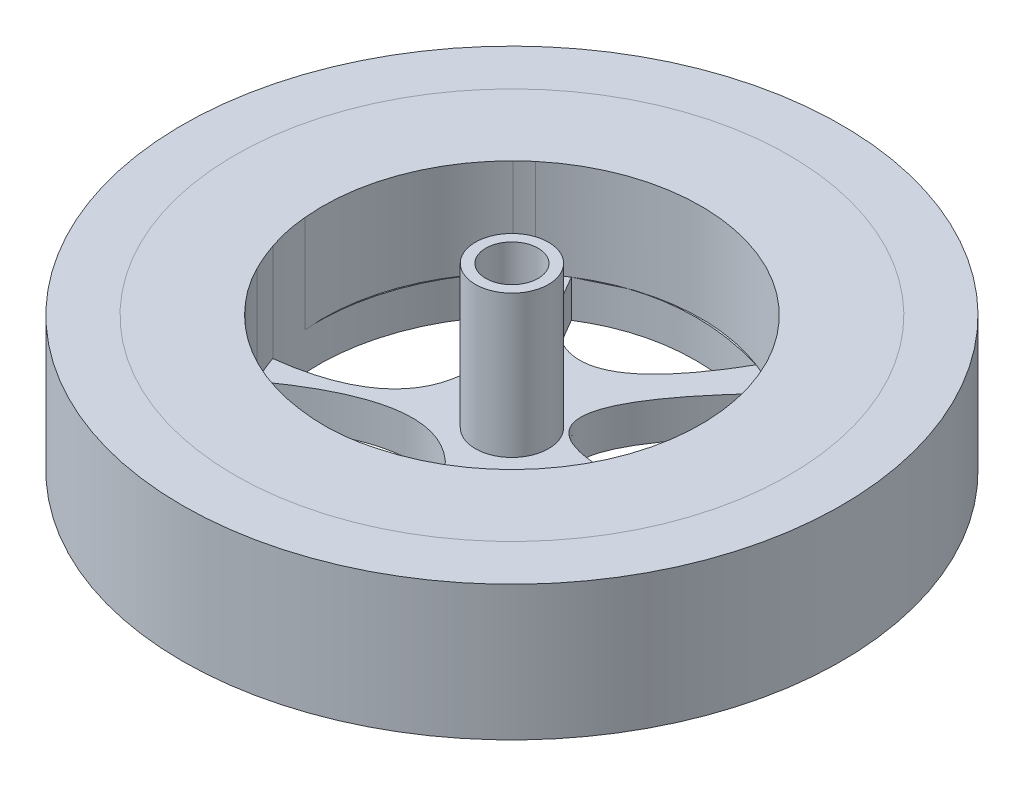
ISO-10303-21;
HEADER;
FILE_DESCRIPTION(('STEP AP214'),'2;1');
FILE_NAME('part.step','',(''),(''),'','','');
FILE_SCHEMA(('AUTOMOTIVE_DESIGN { 1 0 10303 214 1 1 1 1 }'));
ENDSEC;
DATA;
#1=APPLICATION_CONTEXT('core data for automotive mechanical design processes');
#2=APPLICATION_PROTOCOL_DEFINITION('international standard','automotive_design',2000,#1);
#3=PRODUCT_CONTEXT('',#1,'mechanical');
#4=PRODUCT('Part','Part','',(#3));
#5=PRODUCT_RELATED_PRODUCT_CATEGORY('part','',(#4));
#6=PRODUCT_DEFINITION_FORMATION('','',#4);
#7=PRODUCT_DEFINITION_CONTEXT('part definition',#1,'design');
#8=PRODUCT_DEFINITION('design','',#6,#7);
#9=PRODUCT_DEFINITION_SHAPE('','',#8);
#10=(LENGTH_UNIT() NAMED_UNIT(*) SI_UNIT(.MILLI.,.METRE.));
#11=(NAMED_UNIT(*) PLANE_ANGLE_UNIT() SI_UNIT($,.RADIAN.));
#12=(NAMED_UNIT(*) SI_UNIT($,.STERADIAN.) SOLID_ANGLE_UNIT());
#13=UNCERTAINTY_MEASURE_WITH_UNIT(LENGTH_MEASURE(1.E-05),#10,'distance_accuracy_value','');
#14=(GEOMETRIC_REPRESENTATION_CONTEXT(3) GLOBAL_UNCERTAINTY_ASSIGNED_CONTEXT((#13)) GLOBAL_UNIT_ASSIGNED_CONTEXT((#10,
#11,#12)) REPRESENTATION_CONTEXT('',''));
#15=CARTESIAN_POINT('',(0.,0.,0.));
#16=DIRECTION('',(0.,0.,1.));
#17=DIRECTION('',(1.,0.,0.));
#18=AXIS2_PLACEMENT_3D('',#15,#16,#17);
#19=CARTESIAN_POINT('',(0.,6.35,0.));
#20=DIRECTION('',(0.,1.,0.));
#21=DIRECTION('',(0.,0.,1.));
#22=AXIS2_PLACEMENT_3D('',#19,#20,#21);
#23=CYLINDRICAL_SURFACE('',#22,32.0576867537969);
#24=CARTESIAN_POINT('',(0.,6.35,0.));
#25=DIRECTION('',(0.,1.,0.));
#26=DIRECTION('',(0.,0.,1.));
#27=AXIS2_PLACEMENT_3D('',#24,#25,#26);
#28=CIRCLE('',#27,32.0576867537969);
#29=CARTESIAN_POINT('',(-24.4889357233513,6.35,20.6878540970816));
#30=VERTEX_POINT('',#29);
#31=CARTESIAN_POINT('',(-4.15958529377569,6.35,31.786681647954));
#32=VERTEX_POINT('',#31);
#33=EDGE_CURVE('E280',#30,#32,#28,.T.);
#34=ORIENTED_EDGE('',*,*,#33,.F.);
#35=DIRECTION('',(0.,1.,0.));
#36=VECTOR('',#35,1.);
#37=CARTESIAN_POINT('',(-24.4889357233513,0.,20.6878540970816));
#38=LINE('',#37,#36);
#39=CARTESIAN_POINT('',(-24.4889357233513,22.86,20.6878540970816));
#40=VERTEX_POINT('',#39);
#41=EDGE_CURVE('E443',#30,#40,#38,.T.);
#42=ORIENTED_EDGE('',*,*,#41,.T.);
#43=CARTESIAN_POINT('',(0.,22.86,0.));
#44=DIRECTION('',(0.,1.,0.));
#45=DIRECTION('',(0.,0.,1.));
#46=AXIS2_PLACEMENT_3D('',#43,#44,#45);
#47=CIRCLE('',#46,32.0576867537969);
#48=CARTESIAN_POINT('',(-4.15958529377569,22.86,31.786681647954));
#49=VERTEX_POINT('',#48);
#50=EDGE_CURVE('E534',#40,#49,#47,.T.);
#51=ORIENTED_EDGE('',*,*,#50,.T.);
#52=DIRECTION('',(0.,1.,0.));
#53=VECTOR('',#52,1.);
#54=CARTESIAN_POINT('',(-4.15958529377569,0.,31.786681647954));
#55=LINE('',#54,#53);
#56=EDGE_CURVE('E445',#49,#32,#55,.F.);
#57=ORIENTED_EDGE('',*,*,#56,.T.);
#58=EDGE_LOOP('',(#34,#42,#51,#57));
#59=FACE_BOUND('',#58,.T.);
#60=ADVANCED_FACE('F48',(#59),#23,.F.);
#61=CARTESIAN_POINT('',(8.16397022355057,22.86,31.0007237043516));
#62=VERTEX_POINT('',#61);
#63=CARTESIAN_POINT('',(-20.5779379317398,22.86,-24.5813699879001));
#64=VERTEX_POINT('',#63);
#65=EDGE_CURVE('E287',#62,#64,#47,.T.);
#66=ORIENTED_EDGE('',*,*,#65,.T.);
#67=DIRECTION('',(0.,1.,0.));
#68=VECTOR('',#67,1.);
#69=CARTESIAN_POINT('',(-20.5779379317398,0.,-24.5813699879001));
#70=LINE('',#69,#68);
#71=CARTESIAN_POINT('',(-20.5779379317398,6.35,-24.5813699879001));
#72=VERTEX_POINT('',#71);
#73=EDGE_CURVE('E527',#72,#64,#70,.T.);
#74=ORIENTED_EDGE('',*,*,#73,.F.);
#75=CARTESIAN_POINT('',(-17.0629279630063,6.35,-27.1394872710194));
#76=VERTEX_POINT('',#75);
#77=EDGE_CURVE('E345',#76,#72,#28,.T.);
#78=ORIENTED_EDGE('',*,*,#77,.F.);
#79=CARTESIAN_POINT('',(11.4682883276405,6.35,-29.9361594537221));
#80=VERTEX_POINT('',#79);
#81=EDGE_CURVE('E341',#80,#76,#28,.T.);
#82=ORIENTED_EDGE('',*,*,#81,.F.);
#83=CARTESIAN_POINT('',(17.0629279630063,6.35,-27.1394872710194));
#84=VERTEX_POINT('',#83);
#85=EDGE_CURVE('E288',#84,#80,#28,.T.);
#86=ORIENTED_EDGE('',*,*,#85,.F.);
#87=CARTESIAN_POINT('',(30.8335431272262,6.35,-8.77427479772828));
#88=VERTEX_POINT('',#87);
#89=EDGE_CURVE('E296',#88,#84,#28,.T.);
#90=ORIENTED_EDGE('',*,*,#89,.F.);
#91=CARTESIAN_POINT('',(31.8145474832373,6.35,-3.94079286963984));
#92=CARTESIAN_POINT('',(31.4989390578967,6.35,-6.43601726671024));
#93=CARTESIAN_POINT('',(30.8335431272262,6.35,-8.77427479772828));
#94=B_SPLINE_CURVE_WITH_KNOTS('',2,(#91,#92,#93),.UNSPECIFIED.,.F.,.F.,(3,3),(0.,
0.176860399134672),.UNSPECIFIED.);
#95=CARTESIAN_POINT('',(31.8145474832373,6.35,-3.94079286963984));
#96=VERTEX_POINT('',#95);
#97=EDGE_CURVE('E311',#96,#88,#94,.T.);
#98=ORIENTED_EDGE('',*,*,#97,.F.);
#99=CARTESIAN_POINT('',(31.8965552010419,6.35,3.2101473971537));
#100=VERTEX_POINT('',#99);
#101=EDGE_CURVE('E300',#100,#96,#28,.T.);
#102=ORIENTED_EDGE('',*,*,#101,.F.);
#103=CARTESIAN_POINT('',(21.3704995294825,6.35,23.8955441424747));
#104=VERTEX_POINT('',#103);
#105=EDGE_CURVE('E278',#104,#100,#28,.T.);
#106=ORIENTED_EDGE('',*,*,#105,.F.);
#107=CARTESIAN_POINT('',(17.0629279630063,6.35,27.1394872710194));
#108=CARTESIAN_POINT('',(19.3922367173248,6.35,25.6647637193271));
#109=CARTESIAN_POINT('',(21.3704995294825,6.35,23.8955441424747));
#110=B_SPLINE_CURVE_WITH_KNOTS('',2,(#107,#108,#109),.UNSPECIFIED.,.F.,.F.,(3,3),(0.,
0.188533513409088),.UNSPECIFIED.);
#111=CARTESIAN_POINT('',(17.0629279630063,6.35,27.1394872710194));
#112=VERTEX_POINT('',#111);
#113=EDGE_CURVE('E12',#112,#104,#110,.T.);
#114=ORIENTED_EDGE('',*,*,#113,.F.);
#115=CARTESIAN_POINT('',(8.16397022355057,6.35,31.0007237043516));
#116=VERTEX_POINT('',#115);
#117=EDGE_CURVE('E272',#116,#112,#28,.T.);
#118=ORIENTED_EDGE('',*,*,#117,.F.);
#119=DIRECTION('',(0.,1.,0.));
#120=VECTOR('',#119,1.);
#121=CARTESIAN_POINT('',(8.16397022355057,0.,31.0007237043516));
#122=LINE('',#121,#120);
#123=EDGE_CURVE('E384',#116,#62,#122,.T.);
#124=ORIENTED_EDGE('',*,*,#123,.T.);
#125=EDGE_LOOP('',(#66,#74,#78,#82,#86,#90,#98,#102,#106,#114,#118,#124));
#126=FACE_BOUND('',#125,.T.);
#127=ADVANCED_FACE('F336',(#126),#23,.F.);
#128=CARTESIAN_POINT('',(-22.5747317357212,6.35,-22.7612997665948));
#129=VERTEX_POINT('',#128);
#130=CARTESIAN_POINT('',(-31.8965552010419,6.35,3.21014739715361));
#131=VERTEX_POINT('',#130);
#132=EDGE_CURVE('E349',#129,#131,#28,.T.);
#133=ORIENTED_EDGE('',*,*,#132,.F.);
#134=DIRECTION('',(0.,1.,0.));
#135=VECTOR('',#134,1.);
#136=CARTESIAN_POINT('',(-22.5747317357212,0.,-22.7612997665948));
#137=LINE('',#136,#135);
#138=CARTESIAN_POINT('',(-22.5747317357212,22.86,-22.7612997665948));
#139=VERTEX_POINT('',#138);
#140=EDGE_CURVE('E515',#129,#139,#137,.T.);
#141=ORIENTED_EDGE('',*,*,#140,.T.);
#142=CARTESIAN_POINT('',(-31.8965552010419,22.86,3.21014739715361));
#143=VERTEX_POINT('',#142);
#144=EDGE_CURVE('E518',#139,#143,#47,.T.);
#145=ORIENTED_EDGE('',*,*,#144,.T.);
#146=DIRECTION('',(0.,1.,0.));
#147=VECTOR('',#146,1.);
#148=CARTESIAN_POINT('',(-31.8965552010419,0.,3.21014739715361));
#149=LINE('',#148,#147);
#150=EDGE_CURVE('E517',#143,#131,#149,.F.);
#151=ORIENTED_EDGE('',*,*,#150,.T.);
#152=EDGE_LOOP('',(#133,#141,#145,#151));
#153=FACE_BOUND('',#152,.T.);
#154=ADVANCED_FACE('F423',(#153),#23,.F.);
#155=CARTESIAN_POINT('',(0.,6.35,0.));
#156=DIRECTION('',(0.,1.,0.));
#157=DIRECTION('',(0.,0.,1.));
#158=AXIS2_PLACEMENT_3D('',#155,#156,#157);
#159=PLANE('',#158);
#160=CARTESIAN_POINT('',(17.0629279630063,6.35,27.1394872710194));
#161=CARTESIAN_POINT('',(29.4178070091749,6.35,19.317410840012));
#162=CARTESIAN_POINT('',(31.8965552010419,6.35,3.2101473971537));
#163=B_SPLINE_CURVE_WITH_KNOTS('',2,(#160,#161,#162),.UNSPECIFIED.,.F.,.F.,(3,3),(0.,1.),.UNSPECIFIED.);
#164=EDGE_CURVE('E60',#104,#100,#163,.T.);
#165=ORIENTED_EDGE('',*,*,#164,.F.);
#166=ORIENTED_EDGE('',*,*,#105,.T.);
#167=EDGE_LOOP('',(#165,#166));
#168=FACE_BOUND('',#167,.T.);
#169=ADVANCED_FACE('F418',(#168),#159,.T.);
#170=CARTESIAN_POINT('',(-28.4197269968694,6.35,14.8328823034493));
#171=CARTESIAN_POINT('',(-22.0848558767158,6.35,27.5140311485175));
#172=CARTESIAN_POINT('',(-5.53344717434085,6.35,35.1179490173212));
#173=CARTESIAN_POINT('',(8.16397022355057,6.35,31.0007237043516));
#174=B_SPLINE_CURVE_WITH_KNOTS('',3,(#170,#171,#172,#173),.UNSPECIFIED.,.F.,.F.,(4,4),(0.,1.),.UNSPECIFIED.);
#175=EDGE_CURVE('E268',#30,#32,#174,.T.);
#176=ORIENTED_EDGE('',*,*,#175,.F.);
#177=ORIENTED_EDGE('',*,*,#33,.T.);
#178=EDGE_LOOP('',(#176,#177));
#179=FACE_BOUND('',#178,.T.);
#180=ADVANCED_FACE('F448',(#179),#159,.T.);
#181=CARTESIAN_POINT('',(11.4682883276405,6.35,-29.9361594537221));
#182=CARTESIAN_POINT('',(-4.92734295185238,6.35,-34.7692780500741));
#183=CARTESIAN_POINT('',(-17.0629279630063,6.35,-27.1394872710194));
#184=B_SPLINE_CURVE_WITH_KNOTS('',2,(#181,#182,#183),.UNSPECIFIED.,.F.,.F.,(3,3),(0.,1.),.UNSPECIFIED.);
#185=EDGE_CURVE('E179',#80,#76,#184,.T.);
#186=ORIENTED_EDGE('',*,*,#185,.F.);
#187=ORIENTED_EDGE('',*,*,#81,.T.);
#188=EDGE_LOOP('',(#186,#187));
#189=FACE_BOUND('',#188,.T.);
#190=ADVANCED_FACE('F510',(#189),#159,.T.);
#191=CARTESIAN_POINT('',(31.8145474832373,6.35,-3.94079286963984));
#192=CARTESIAN_POINT('',(30.0300415854512,6.35,-18.0492332513128));
#193=CARTESIAN_POINT('',(17.0629279630063,6.35,-27.1394872710194));
#194=B_SPLINE_CURVE_WITH_KNOTS('',2,(#191,#192,#193),.UNSPECIFIED.,.F.,.F.,(3,3),(0.,1.),.UNSPECIFIED.);
#195=EDGE_CURVE('E307',#88,#84,#194,.T.);
#196=ORIENTED_EDGE('',*,*,#195,.F.);
#197=ORIENTED_EDGE('',*,*,#89,.T.);
#198=EDGE_LOOP('',(#196,#197));
#199=FACE_BOUND('',#198,.T.);
#200=ADVANCED_FACE('F334',(#199),#159,.T.);
#201=CARTESIAN_POINT('',(-20.5779379317398,6.35,-24.5813699879001));
#202=CARTESIAN_POINT('',(-30.1618393562321,6.35,-16.6983227587179));
#203=CARTESIAN_POINT('',(-34.6224155302624,6.35,-1.50650750556274));
#204=CARTESIAN_POINT('',(-30.4142395862792,6.35,10.1325865598561));
#205=B_SPLINE_CURVE_WITH_KNOTS('',3,(#201,#202,#203,#204),.UNSPECIFIED.,.F.,.F.,(4,4),(0.,1.),.UNSPECIFIED.);
#206=EDGE_CURVE('E474',#129,#131,#205,.T.);
#207=ORIENTED_EDGE('',*,*,#206,.F.);
#208=ORIENTED_EDGE('',*,*,#132,.T.);
#209=EDGE_LOOP('',(#207,#208));
#210=FACE_BOUND('',#209,.T.);
#211=ADVANCED_FACE('F419',(#210),#159,.T.);
#212=CARTESIAN_POINT('',(0.,22.86,0.));
#213=DIRECTION('',(0.,-1.,0.));
#214=DIRECTION('',(0.,0.,-1.));
#215=AXIS2_PLACEMENT_3D('',#212,#213,#214);
#216=CYLINDRICAL_SURFACE('',#215,46.99);
#217=CARTESIAN_POINT('',(0.,22.86,0.));
#218=DIRECTION('',(0.,1.,0.));
#219=DIRECTION('',(0.,0.,1.));
#220=AXIS2_PLACEMENT_3D('',#217,#218,#219);
#221=CIRCLE('',#220,46.99);
#222=CARTESIAN_POINT('',(0.,22.86,46.99));
#223=VERTEX_POINT('',#222);
#224=EDGE_CURVE('E489',#223,#223,#221,.T.);
#225=ORIENTED_EDGE('',*,*,#224,.F.);
#226=EDGE_LOOP('',(#225));
#227=FACE_BOUND('',#226,.T.);
#228=CARTESIAN_POINT('',(0.,0.,0.));
#229=DIRECTION('',(0.,1.,0.));
#230=DIRECTION('',(0.,0.,1.));
#231=AXIS2_PLACEMENT_3D('',#228,#229,#230);
#232=CIRCLE('',#231,46.99);
#233=CARTESIAN_POINT('',(0.,0.,46.99));
#234=VERTEX_POINT('',#233);
#235=EDGE_CURVE('E277',#234,#234,#232,.T.);
#236=ORIENTED_EDGE('',*,*,#235,.T.);
#237=EDGE_LOOP('',(#236));
#238=FACE_BOUND('',#237,.T.);
#239=ADVANCED_FACE('F50',(#227,#238),#216,.T.);
#240=CARTESIAN_POINT('',(0.,22.86,0.));
#241=DIRECTION('',(0.,1.,0.));
#242=DIRECTION('',(0.,0.,1.));
#243=AXIS2_PLACEMENT_3D('',#240,#241,#242);
#244=PLANE('',#243);
#245=CARTESIAN_POINT('',(-28.4197269968694,22.86,14.8328823034493));
#246=CARTESIAN_POINT('',(-22.0848558767158,22.86,27.5140311485175));
#247=CARTESIAN_POINT('',(-5.53344717434085,22.86,35.1179490173212));
#248=CARTESIAN_POINT('',(8.16397022355057,22.86,31.0007237043516));
#249=B_SPLINE_CURVE_WITH_KNOTS('',3,(#245,#246,#247,#248),.UNSPECIFIED.,.F.,.F.,(4,4),(0.,1.),.UNSPECIFIED.);
#250=CARTESIAN_POINT('',(-28.4197269968694,22.86,14.8328823034493));
#251=VERTEX_POINT('',#250);
#252=EDGE_CURVE('E387',#251,#40,#249,.T.);
#253=ORIENTED_EDGE('',*,*,#252,.F.);
#254=CARTESIAN_POINT('',(-30.4142395862792,22.86,10.1325865598561));
#255=VERTEX_POINT('',#254);
#256=EDGE_CURVE('E375',#255,#251,#47,.T.);
#257=ORIENTED_EDGE('',*,*,#256,.F.);
#258=CARTESIAN_POINT('',(-20.5779379317398,22.86,-24.5813699879001));
#259=CARTESIAN_POINT('',(-30.1618393562321,22.86,-16.6983227587179));
#260=CARTESIAN_POINT('',(-34.6224155302624,22.86,-1.50650750556274));
#261=CARTESIAN_POINT('',(-30.4142395862792,22.86,10.1325865598561));
#262=B_SPLINE_CURVE_WITH_KNOTS('',3,(#258,#259,#260,#261),.UNSPECIFIED.,.F.,.F.,(4,4),(0.,1.),.UNSPECIFIED.);
#263=EDGE_CURVE('E383',#143,#255,#262,.T.);
#264=ORIENTED_EDGE('',*,*,#263,.F.);
#265=ORIENTED_EDGE('',*,*,#144,.F.);
#266=EDGE_CURVE('E400',#64,#139,#262,.T.);
#267=ORIENTED_EDGE('',*,*,#266,.F.);
#268=ORIENTED_EDGE('',*,*,#65,.F.);
#269=EDGE_CURVE('E556',#49,#62,#249,.T.);
#270=ORIENTED_EDGE('',*,*,#269,.F.);
#271=ORIENTED_EDGE('',*,*,#50,.F.);
#272=EDGE_LOOP('',(#253,#257,#264,#265,#267,#268,#270,#271));
#273=FACE_BOUND('',#272,.T.);
#274=ORIENTED_EDGE('',*,*,#224,.T.);
#275=EDGE_LOOP('',(#274));
#276=FACE_BOUND('',#275,.T.);
#277=ADVANCED_FACE('F424',(#273,#276),#244,.T.);
#278=CARTESIAN_POINT('',(0.,0.,0.));
#279=DIRECTION('',(0.,1.,0.));
#280=DIRECTION('',(0.,0.,1.));
#281=AXIS2_PLACEMENT_3D('',#278,#279,#280);
#282=PLANE('',#281);
#283=CARTESIAN_POINT('',(31.8965552010419,0.,3.2101473971537));
#284=CARTESIAN_POINT('',(-6.40809726205317,0.,-5.16641804846701));
#285=CARTESIAN_POINT('',(17.0629279630063,0.,27.1394872710194));
#286=B_SPLINE_CURVE_WITH_KNOTS('',2,(#283,#284,#285),.UNSPECIFIED.,.F.,.F.,(3,3),(0.,1.),.UNSPECIFIED.);
#287=CARTESIAN_POINT('',(31.8965552010419,0.,3.2101473971537));
#288=VERTEX_POINT('',#287);
#289=CARTESIAN_POINT('',(17.0629279630063,0.,27.1394872710194));
#290=VERTEX_POINT('',#289);
#291=EDGE_CURVE('E565',#288,#290,#286,.T.);
#292=ORIENTED_EDGE('',*,*,#291,.T.);
#293=CARTESIAN_POINT('',(17.0629279630063,0.,27.1394872710194));
#294=CARTESIAN_POINT('',(29.4178070091749,0.,19.317410840012));
#295=CARTESIAN_POINT('',(31.8965552010419,0.,3.2101473971537));
#296=B_SPLINE_CURVE_WITH_KNOTS('',2,(#293,#294,#295),.UNSPECIFIED.,.F.,.F.,(3,3),(0.,1.),.UNSPECIFIED.);
#297=EDGE_CURVE('E67',#290,#288,#296,.T.);
#298=ORIENTED_EDGE('',*,*,#297,.T.);
#299=EDGE_LOOP('',(#292,#298));
#300=FACE_BOUND('',#299,.T.);
#301=CARTESIAN_POINT('',(8.16397022355057,0.,31.0007237043516));
#302=CARTESIAN_POINT('',(1.24408556891852,0.,-6.71456539214169));
#303=CARTESIAN_POINT('',(-28.4197269968694,0.,14.8328823034493));
#304=B_SPLINE_CURVE_WITH_KNOTS('',2,(#301,#302,#303),.UNSPECIFIED.,.F.,.F.,(3,3),(0.,1.),.UNSPECIFIED.);
#305=CARTESIAN_POINT('',(8.16397022355057,0.,31.0007237043516));
#306=VERTEX_POINT('',#305);
#307=CARTESIAN_POINT('',(-28.4197269968694,0.,14.8328823034493));
#308=VERTEX_POINT('',#307);
#309=EDGE_CURVE('E559',#306,#308,#304,.T.);
#310=ORIENTED_EDGE('',*,*,#309,.T.);
#311=CARTESIAN_POINT('',(-28.4197269968694,0.,14.8328823034493));
#312=CARTESIAN_POINT('',(-22.0848558767158,0.,27.5140311485175));
#313=CARTESIAN_POINT('',(-5.53344717434085,0.,35.1179490173212));
#314=CARTESIAN_POINT('',(8.16397022355057,0.,31.0007237043516));
#315=B_SPLINE_CURVE_WITH_KNOTS('',3,(#311,#312,#313,#314),.UNSPECIFIED.,.F.,.F.,(4,4),(0.,1.),.UNSPECIFIED.);
#316=EDGE_CURVE('E75',#308,#306,#315,.T.);
#317=ORIENTED_EDGE('',*,*,#316,.T.);
#318=EDGE_LOOP('',(#310,#317));
#319=FACE_BOUND('',#318,.T.);
#320=CARTESIAN_POINT('',(-17.0629279630063,0.,-27.1394872710194));
#321=CARTESIAN_POINT('',(-3.9434548840503,0.,-2.82675283407313));
#322=CARTESIAN_POINT('',(11.4682883276405,0.,-29.9361594537221));
#323=B_SPLINE_CURVE_WITH_KNOTS('',2,(#320,#321,#322),.UNSPECIFIED.,.F.,.F.,(3,3),(0.,1.),.UNSPECIFIED.);
#324=CARTESIAN_POINT('',(-17.0629279630063,0.,-27.1394872710194));
#325=VERTEX_POINT('',#324);
#326=CARTESIAN_POINT('',(11.4682883276405,0.,-29.9361594537221));
#327=VERTEX_POINT('',#326);
#328=EDGE_CURVE('E184',#325,#327,#323,.T.);
#329=ORIENTED_EDGE('',*,*,#328,.T.);
#330=CARTESIAN_POINT('',(11.4682883276405,0.,-29.9361594537221));
#331=CARTESIAN_POINT('',(-4.92734295185238,0.,-34.7692780500741));
#332=CARTESIAN_POINT('',(-17.0629279630063,0.,-27.1394872710194));
#333=B_SPLINE_CURVE_WITH_KNOTS('',2,(#330,#331,#332),.UNSPECIFIED.,.F.,.F.,(3,3),(0.,1.),.UNSPECIFIED.);
#334=EDGE_CURVE('E176',#327,#325,#333,.T.);
#335=ORIENTED_EDGE('',*,*,#334,.T.);
#336=EDGE_LOOP('',(#329,#335));
#337=FACE_BOUND('',#336,.T.);
#338=CARTESIAN_POINT('',(17.0629279630064,0.,-27.1394872710194));
#339=CARTESIAN_POINT('',(-14.4432323297696,0.,5.93598415211284));
#340=CARTESIAN_POINT('',(31.8145474832373,0.,-3.94079286963984));
#341=B_SPLINE_CURVE_WITH_KNOTS('',2,(#338,#339,#340),.UNSPECIFIED.,.F.,.F.,(3,3),(0.,1.),.UNSPECIFIED.);
#342=CARTESIAN_POINT('',(17.0629279630064,0.,-27.1394872710194));
#343=VERTEX_POINT('',#342);
#344=CARTESIAN_POINT('',(31.8145474832373,0.,-3.94079286963984));
#345=VERTEX_POINT('',#344);
#346=EDGE_CURVE('E225',#343,#345,#341,.T.);
#347=ORIENTED_EDGE('',*,*,#346,.T.);
#348=CARTESIAN_POINT('',(31.8145474832373,0.,-3.94079286963984));
#349=CARTESIAN_POINT('',(30.0300415854512,0.,-18.0492332513128));
#350=CARTESIAN_POINT('',(17.0629279630063,0.,-27.1394872710194));
#351=B_SPLINE_CURVE_WITH_KNOTS('',2,(#348,#349,#350),.UNSPECIFIED.,.F.,.F.,(3,3),(0.,1.),.UNSPECIFIED.);
#352=EDGE_CURVE('E233',#345,#343,#351,.T.);
#353=ORIENTED_EDGE('',*,*,#352,.T.);
#354=EDGE_LOOP('',(#347,#353));
#355=FACE_BOUND('',#354,.T.);
#356=CARTESIAN_POINT('',(-30.4142395862792,0.,10.1325865598561));
#357=CARTESIAN_POINT('',(-3.93980400579624,0.,6.87831162450716));
#358=CARTESIAN_POINT('',(-10.9003580673517,0.,-13.2336521721235));
#359=CARTESIAN_POINT('',(-20.5779379317398,0.,-24.5813699879001));
#360=B_SPLINE_CURVE_WITH_KNOTS('',3,(#356,#357,#358,#359),.UNSPECIFIED.,.F.,.F.,(4,4),(0.,1.),.UNSPECIFIED.);
#361=CARTESIAN_POINT('',(-30.4142395862792,0.,10.1325865598561));
#362=VERTEX_POINT('',#361);
#363=CARTESIAN_POINT('',(-20.5779379317398,0.,-24.5813699879001));
#364=VERTEX_POINT('',#363);
#365=EDGE_CURVE('E399',#362,#364,#360,.T.);
#366=ORIENTED_EDGE('',*,*,#365,.T.);
#367=CARTESIAN_POINT('',(-20.5779379317398,0.,-24.5813699879001));
#368=CARTESIAN_POINT('',(-30.1618393562321,0.,-16.6983227587179));
#369=CARTESIAN_POINT('',(-34.6224155302624,0.,-1.50650750556274));
#370=CARTESIAN_POINT('',(-30.4142395862792,0.,10.1325865598561));
#371=B_SPLINE_CURVE_WITH_KNOTS('',3,(#367,#368,#369,#370),.UNSPECIFIED.,.F.,.F.,(4,4),(0.,1.),.UNSPECIFIED.);
#372=EDGE_CURVE('E392',#364,#362,#371,.T.);
#373=ORIENTED_EDGE('',*,*,#372,.T.);
#374=EDGE_LOOP('',(#366,#373));
#375=FACE_BOUND('',#374,.T.);
#376=ORIENTED_EDGE('',*,*,#235,.F.);
#377=EDGE_LOOP('',(#376));
#378=FACE_BOUND('',#377,.T.);
#379=ADVANCED_FACE('F191',(#300,#319,#337,#355,#375,#378),#282,.F.);
#380=ORIENTED_EDGE('',*,*,#256,.T.);
#381=DIRECTION('',(0.,1.,0.));
#382=VECTOR('',#381,1.);
#383=CARTESIAN_POINT('',(-28.4197269968694,0.,14.8328823034493));
#384=LINE('',#383,#382);
#385=CARTESIAN_POINT('',(-28.4197269968694,6.35,14.8328823034493));
#386=VERTEX_POINT('',#385);
#387=EDGE_CURVE('E374',#386,#251,#384,.T.);
#388=ORIENTED_EDGE('',*,*,#387,.F.);
#389=CARTESIAN_POINT('',(-30.4142395862792,6.35,10.1325865598561));
#390=VERTEX_POINT('',#389);
#391=EDGE_CURVE('E286',#390,#386,#28,.T.);
#392=ORIENTED_EDGE('',*,*,#391,.F.);
#393=DIRECTION('',(0.,1.,0.));
#394=VECTOR('',#393,1.);
#395=CARTESIAN_POINT('',(-30.4142395862792,0.,10.1325865598561));
#396=LINE('',#395,#394);
#397=EDGE_CURVE('E372',#390,#255,#396,.T.);
#398=ORIENTED_EDGE('',*,*,#397,.T.);
#399=EDGE_LOOP('',(#380,#388,#392,#398));
#400=FACE_BOUND('',#399,.T.);
#401=ADVANCED_FACE('F370',(#400),#23,.F.);
#402=CARTESIAN_POINT('',(0.,6.35,0.));
#403=DIRECTION('',(0.,1.,0.));
#404=DIRECTION('',(0.,0.,1.));
#405=AXIS2_PLACEMENT_3D('',#402,#403,#404);
#406=CIRCLE('',#405,6.19802202446606);
#407=CARTESIAN_POINT('',(0.,6.34999999999999,-6.19802202446606));
#408=VERTEX_POINT('',#407);
#409=EDGE_CURVE('E198',#408,#408,#406,.T.);
#410=ORIENTED_EDGE('',*,*,#409,.F.);
#411=EDGE_LOOP('',(#410));
#412=FACE_BOUND('',#411,.T.);
#413=CARTESIAN_POINT('',(31.8965552010419,6.35,3.2101473971537));
#414=CARTESIAN_POINT('',(-6.40809726205317,6.35,-5.16641804846701));
#415=CARTESIAN_POINT('',(17.0629279630063,6.35,27.1394872710194));
#416=B_SPLINE_CURVE_WITH_KNOTS('',2,(#413,#414,#415),.UNSPECIFIED.,.F.,.F.,(3,3),(0.,1.),.UNSPECIFIED.);
#417=EDGE_CURVE('E264',#100,#112,#416,.T.);
#418=ORIENTED_EDGE('',*,*,#417,.F.);
#419=ORIENTED_EDGE('',*,*,#101,.T.);
#420=CARTESIAN_POINT('',(17.0629279630064,6.35,-27.1394872710194));
#421=CARTESIAN_POINT('',(-14.4432323297696,6.35,5.93598415211284));
#422=CARTESIAN_POINT('',(31.8145474832373,6.35,-3.94079286963984));
#423=B_SPLINE_CURVE_WITH_KNOTS('',2,(#420,#421,#422),.UNSPECIFIED.,.F.,.F.,(3,3),(0.,1.),.UNSPECIFIED.);
#424=EDGE_CURVE('E304',#84,#96,#423,.T.);
#425=ORIENTED_EDGE('',*,*,#424,.F.);
#426=ORIENTED_EDGE('',*,*,#85,.T.);
#427=CARTESIAN_POINT('',(-17.0629279630063,6.35,-27.1394872710194));
#428=CARTESIAN_POINT('',(-3.9434548840503,6.35,-2.82675283407313));
#429=CARTESIAN_POINT('',(11.4682883276405,6.35,-29.9361594537221));
#430=B_SPLINE_CURVE_WITH_KNOTS('',2,(#427,#428,#429),.UNSPECIFIED.,.F.,.F.,(3,3),(0.,1.),.UNSPECIFIED.);
#431=EDGE_CURVE('E331',#76,#80,#430,.T.);
#432=ORIENTED_EDGE('',*,*,#431,.F.);
#433=ORIENTED_EDGE('',*,*,#77,.T.);
#434=CARTESIAN_POINT('',(-30.4142395862792,6.35,10.1325865598561));
#435=CARTESIAN_POINT('',(-3.93980400579624,6.35,6.87831162450716));
#436=CARTESIAN_POINT('',(-10.9003580673517,6.35,-13.2336521721235));
#437=CARTESIAN_POINT('',(-20.5779379317398,6.35,-24.5813699879001));
#438=B_SPLINE_CURVE_WITH_KNOTS('',3,(#434,#435,#436,#437),.UNSPECIFIED.,.F.,.F.,(4,4),(0.,1.),.UNSPECIFIED.);
#439=EDGE_CURVE('E365',#390,#72,#438,.T.);
#440=ORIENTED_EDGE('',*,*,#439,.F.);
#441=ORIENTED_EDGE('',*,*,#391,.T.);
#442=CARTESIAN_POINT('',(8.16397022355057,6.35,31.0007237043516));
#443=CARTESIAN_POINT('',(1.24408556891852,6.35,-6.71456539214169));
#444=CARTESIAN_POINT('',(-28.4197269968694,6.35,14.8328823034493));
#445=B_SPLINE_CURVE_WITH_KNOTS('',2,(#442,#443,#444),.UNSPECIFIED.,.F.,.F.,(3,3),(0.,1.),.UNSPECIFIED.);
#446=EDGE_CURVE('E363',#116,#386,#445,.T.);
#447=ORIENTED_EDGE('',*,*,#446,.F.);
#448=ORIENTED_EDGE('',*,*,#117,.T.);
#449=EDGE_LOOP('',(#418,#419,#425,#426,#432,#433,#440,#441,#447,#448));
#450=FACE_BOUND('',#449,.T.);
#451=ADVANCED_FACE('F362',(#412,#450),#159,.T.);
#452=DIRECTION('',(0.,1.,0.));
#453=VECTOR('',#452,1.);
#454=SURFACE_OF_LINEAR_EXTRUSION('',#371,#453);
#455=ORIENTED_EDGE('',*,*,#206,.T.);
#456=ORIENTED_EDGE('',*,*,#150,.F.);
#457=ORIENTED_EDGE('',*,*,#263,.T.);
#458=ORIENTED_EDGE('',*,*,#397,.F.);
#459=EDGE_CURVE('E530',#362,#390,#396,.T.);
#460=ORIENTED_EDGE('',*,*,#459,.F.);
#461=ORIENTED_EDGE('',*,*,#372,.F.);
#462=EDGE_CURVE('E521',#364,#72,#70,.T.);
#463=ORIENTED_EDGE('',*,*,#462,.T.);
#464=ORIENTED_EDGE('',*,*,#73,.T.);
#465=ORIENTED_EDGE('',*,*,#266,.T.);
#466=ORIENTED_EDGE('',*,*,#140,.F.);
#467=EDGE_LOOP('',(#455,#456,#457,#458,#460,#461,#463,#464,#465,#466));
#468=FACE_BOUND('',#467,.T.);
#469=ADVANCED_FACE('F409',(#468),#454,.F.);
#470=DIRECTION('',(0.,1.,0.));
#471=VECTOR('',#470,1.);
#472=SURFACE_OF_LINEAR_EXTRUSION('',#360,#471);
#473=ORIENTED_EDGE('',*,*,#439,.T.);
#474=ORIENTED_EDGE('',*,*,#462,.F.);
#475=ORIENTED_EDGE('',*,*,#365,.F.);
#476=ORIENTED_EDGE('',*,*,#459,.T.);
#477=EDGE_LOOP('',(#473,#474,#475,#476));
#478=FACE_BOUND('',#477,.T.);
#479=ADVANCED_FACE('F413',(#478),#472,.F.);
#480=DIRECTION('',(0.,1.,0.));
#481=VECTOR('',#480,1.);
#482=SURFACE_OF_LINEAR_EXTRUSION('',#351,#481);
#483=ORIENTED_EDGE('',*,*,#97,.T.);
#484=ORIENTED_EDGE('',*,*,#195,.T.);
#485=DIRECTION('',(0.,1.,0.));
#486=VECTOR('',#485,1.);
#487=CARTESIAN_POINT('',(17.0629279630064,0.,-27.1394872710194));
#488=LINE('',#487,#486);
#489=EDGE_CURVE('E232',#343,#84,#488,.T.);
#490=ORIENTED_EDGE('',*,*,#489,.F.);
#491=ORIENTED_EDGE('',*,*,#352,.F.);
#492=DIRECTION('',(0.,1.,0.));
#493=VECTOR('',#492,1.);
#494=CARTESIAN_POINT('',(31.8145474832373,0.,-3.94079286963984));
#495=LINE('',#494,#493);
#496=EDGE_CURVE('E244',#345,#96,#495,.T.);
#497=ORIENTED_EDGE('',*,*,#496,.T.);
#498=EDGE_LOOP('',(#483,#484,#490,#491,#497));
#499=FACE_BOUND('',#498,.T.);
#500=ADVANCED_FACE('F220',(#499),#482,.F.);
#501=DIRECTION('',(0.,1.,0.));
#502=VECTOR('',#501,1.);
#503=SURFACE_OF_LINEAR_EXTRUSION('',#341,#502);
#504=ORIENTED_EDGE('',*,*,#424,.T.);
#505=ORIENTED_EDGE('',*,*,#496,.F.);
#506=ORIENTED_EDGE('',*,*,#346,.F.);
#507=ORIENTED_EDGE('',*,*,#489,.T.);
#508=EDGE_LOOP('',(#504,#505,#506,#507));
#509=FACE_BOUND('',#508,.T.);
#510=ADVANCED_FACE('F215',(#509),#503,.F.);
#511=DIRECTION('',(0.,1.,0.));
#512=VECTOR('',#511,1.);
#513=SURFACE_OF_LINEAR_EXTRUSION('',#333,#512);
#514=ORIENTED_EDGE('',*,*,#185,.T.);
#515=DIRECTION('',(0.,1.,0.));
#516=VECTOR('',#515,1.);
#517=CARTESIAN_POINT('',(-17.0629279630063,0.,-27.1394872710194));
#518=LINE('',#517,#516);
#519=EDGE_CURVE('E171',#325,#76,#518,.T.);
#520=ORIENTED_EDGE('',*,*,#519,.F.);
#521=ORIENTED_EDGE('',*,*,#334,.F.);
#522=DIRECTION('',(0.,1.,0.));
#523=VECTOR('',#522,1.);
#524=CARTESIAN_POINT('',(11.4682883276405,0.,-29.9361594537221));
#525=LINE('',#524,#523);
#526=EDGE_CURVE('E183',#327,#80,#525,.T.);
#527=ORIENTED_EDGE('',*,*,#526,.T.);
#528=EDGE_LOOP('',(#514,#520,#521,#527));
#529=FACE_BOUND('',#528,.T.);
#530=ADVANCED_FACE('F173',(#529),#513,.F.);
#531=DIRECTION('',(0.,1.,0.));
#532=VECTOR('',#531,1.);
#533=SURFACE_OF_LINEAR_EXTRUSION('',#323,#532);
#534=ORIENTED_EDGE('',*,*,#431,.T.);
#535=ORIENTED_EDGE('',*,*,#526,.F.);
#536=ORIENTED_EDGE('',*,*,#328,.F.);
#537=ORIENTED_EDGE('',*,*,#519,.T.);
#538=EDGE_LOOP('',(#534,#535,#536,#537));
#539=FACE_BOUND('',#538,.T.);
#540=ADVANCED_FACE('F187',(#539),#533,.F.);
#541=DIRECTION('',(0.,1.,0.));
#542=VECTOR('',#541,1.);
#543=SURFACE_OF_LINEAR_EXTRUSION('',#315,#542);
#544=ORIENTED_EDGE('',*,*,#175,.T.);
#545=ORIENTED_EDGE('',*,*,#56,.F.);
#546=ORIENTED_EDGE('',*,*,#269,.T.);
#547=ORIENTED_EDGE('',*,*,#123,.F.);
#548=EDGE_CURVE('E379',#306,#116,#122,.T.);
#549=ORIENTED_EDGE('',*,*,#548,.F.);
#550=ORIENTED_EDGE('',*,*,#316,.F.);
#551=EDGE_CURVE('E378',#308,#386,#384,.T.);
#552=ORIENTED_EDGE('',*,*,#551,.T.);
#553=ORIENTED_EDGE('',*,*,#387,.T.);
#554=ORIENTED_EDGE('',*,*,#252,.T.);
#555=ORIENTED_EDGE('',*,*,#41,.F.);
#556=EDGE_LOOP('',(#544,#545,#546,#547,#549,#550,#552,#553,#554,#555));
#557=FACE_BOUND('',#556,.T.);
#558=ADVANCED_FACE('F582',(#557),#543,.F.);
#559=DIRECTION('',(0.,1.,0.));
#560=VECTOR('',#559,1.);
#561=SURFACE_OF_LINEAR_EXTRUSION('',#304,#560);
#562=ORIENTED_EDGE('',*,*,#446,.T.);
#563=ORIENTED_EDGE('',*,*,#551,.F.);
#564=ORIENTED_EDGE('',*,*,#309,.F.);
#565=ORIENTED_EDGE('',*,*,#548,.T.);
#566=EDGE_LOOP('',(#562,#563,#564,#565));
#567=FACE_BOUND('',#566,.T.);
#568=ADVANCED_FACE('F585',(#567),#561,.F.);
#569=DIRECTION('',(0.,1.,0.));
#570=VECTOR('',#569,1.);
#571=SURFACE_OF_LINEAR_EXTRUSION('',#296,#570);
#572=ORIENTED_EDGE('',*,*,#113,.T.);
#573=ORIENTED_EDGE('',*,*,#164,.T.);
#574=DIRECTION('',(0.,1.,0.));
#575=VECTOR('',#574,1.);
#576=CARTESIAN_POINT('',(31.8965552010419,0.,3.2101473971537));
#577=LINE('',#576,#575);
#578=EDGE_CURVE('E562',#288,#100,#577,.T.);
#579=ORIENTED_EDGE('',*,*,#578,.F.);
#580=ORIENTED_EDGE('',*,*,#297,.F.);
#581=DIRECTION('',(0.,1.,0.));
#582=VECTOR('',#581,1.);
#583=CARTESIAN_POINT('',(17.0629279630063,0.,27.1394872710194));
#584=LINE('',#583,#582);
#585=EDGE_CURVE('E289',#290,#112,#584,.T.);
#586=ORIENTED_EDGE('',*,*,#585,.T.);
#587=EDGE_LOOP('',(#572,#573,#579,#580,#586));
#588=FACE_BOUND('',#587,.T.);
#589=ADVANCED_FACE('F588',(#588),#571,.F.);
#590=DIRECTION('',(0.,1.,0.));
#591=VECTOR('',#590,1.);
#592=SURFACE_OF_LINEAR_EXTRUSION('',#286,#591);
#593=ORIENTED_EDGE('',*,*,#417,.T.);
#594=ORIENTED_EDGE('',*,*,#585,.F.);
#595=ORIENTED_EDGE('',*,*,#291,.F.);
#596=ORIENTED_EDGE('',*,*,#578,.T.);
#597=EDGE_LOOP('',(#593,#594,#595,#596));
#598=FACE_BOUND('',#597,.T.);
#599=ADVANCED_FACE('F592',(#598),#592,.F.);
#600=CARTESIAN_POINT('',(0.,30.48,0.));
#601=DIRECTION('',(0.,-1.,0.));
#602=DIRECTION('',(0.,0.,-1.));
#603=AXIS2_PLACEMENT_3D('',#600,#601,#602);
#604=CYLINDRICAL_SURFACE('',#603,6.19802202446606);
#605=CARTESIAN_POINT('',(0.,30.48,0.));
#606=DIRECTION('',(0.,1.,0.));
#607=DIRECTION('',(0.,0.,1.));
#608=AXIS2_PLACEMENT_3D('',#605,#606,#607);
#609=CIRCLE('',#608,6.19802202446606);
#610=CARTESIAN_POINT('',(0.,30.48,-6.19802202446606));
#611=VERTEX_POINT('',#610);
#612=EDGE_CURVE('E194',#611,#611,#609,.T.);
#613=CARTESIAN_POINT('',(0.,30.48,-6.19802202446606));
#614=CARTESIAN_POINT('',(0.,30.2286458333333,-6.19802202446606));
#615=CARTESIAN_POINT('',(0.,29.9772916666667,-6.19802202446606));
#616=CARTESIAN_POINT('',(0.,29.4745833333333,-6.19802202446606));
#617=CARTESIAN_POINT('',(0.,29.2232291666667,-6.19802202446606));
#618=CARTESIAN_POINT('',(0.,28.7205208333333,-6.19802202446606));
#619=CARTESIAN_POINT('',(0.,28.4691666666667,-6.19802202446606));
#620=CARTESIAN_POINT('',(0.,27.9664583333333,-6.19802202446606));
#621=CARTESIAN_POINT('',(0.,27.7151041666667,-6.19802202446606));
#622=CARTESIAN_POINT('',(0.,27.2123958333333,-6.19802202446606));
#623=CARTESIAN_POINT('',(0.,26.9610416666667,-6.19802202446606));
#624=CARTESIAN_POINT('',(0.,26.4583333333333,-6.19802202446606));
#625=CARTESIAN_POINT('',(0.,26.2069791666667,-6.19802202446606));
#626=CARTESIAN_POINT('',(0.,25.7042708333333,-6.19802202446606));
#627=CARTESIAN_POINT('',(0.,25.4529166666667,-6.19802202446606));
#628=CARTESIAN_POINT('',(0.,24.9502083333333,-6.19802202446606));
#629=CARTESIAN_POINT('',(0.,24.6988541666667,-6.19802202446606));
#630=CARTESIAN_POINT('',(0.,24.1961458333333,-6.19802202446606));
#631=CARTESIAN_POINT('',(0.,23.9447916666667,-6.19802202446606));
#632=CARTESIAN_POINT('',(0.,23.4420833333333,-6.19802202446606));
#633=CARTESIAN_POINT('',(0.,23.1907291666667,-6.19802202446606));
#634=CARTESIAN_POINT('',(0.,22.6880208333333,-6.19802202446606));
#635=CARTESIAN_POINT('',(0.,22.4366666666667,-6.19802202446606));
#636=CARTESIAN_POINT('',(0.,21.9339583333333,-6.19802202446606));
#637=CARTESIAN_POINT('',(0.,21.6826041666667,-6.19802202446606));
#638=CARTESIAN_POINT('',(0.,21.1798958333333,-6.19802202446606));
#639=CARTESIAN_POINT('',(0.,20.9285416666667,-6.19802202446606));
#640=CARTESIAN_POINT('',(0.,20.4258333333333,-6.19802202446606));
#641=CARTESIAN_POINT('',(0.,20.1744791666667,-6.19802202446606));
#642=CARTESIAN_POINT('',(0.,19.6717708333333,-6.19802202446606));
#643=CARTESIAN_POINT('',(0.,19.4204166666667,-6.19802202446606));
#644=CARTESIAN_POINT('',(0.,18.9177083333333,-6.19802202446606));
#645=CARTESIAN_POINT('',(0.,18.6663541666667,-6.19802202446606));
#646=CARTESIAN_POINT('',(0.,18.1636458333333,-6.19802202446606));
#647=CARTESIAN_POINT('',(0.,17.9122916666667,-6.19802202446606));
#648=CARTESIAN_POINT('',(0.,17.4095833333333,-6.19802202446606));
#649=CARTESIAN_POINT('',(0.,17.1582291666667,-6.19802202446606));
#650=CARTESIAN_POINT('',(0.,16.6555208333333,-6.19802202446606));
#651=CARTESIAN_POINT('',(0.,16.4041666666667,-6.19802202446606));
#652=CARTESIAN_POINT('',(0.,15.9014583333333,-6.19802202446606));
#653=CARTESIAN_POINT('',(0.,15.6501041666667,-6.19802202446606));
#654=CARTESIAN_POINT('',(0.,15.1473958333333,-6.19802202446606));
#655=CARTESIAN_POINT('',(0.,14.8960416666667,-6.19802202446606));
#656=CARTESIAN_POINT('',(0.,14.3933333333333,-6.19802202446606));
#657=CARTESIAN_POINT('',(0.,14.1419791666667,-6.19802202446606));
#658=CARTESIAN_POINT('',(0.,13.6392708333333,-6.19802202446606));
#659=CARTESIAN_POINT('',(0.,13.3879166666667,-6.19802202446606));
#660=CARTESIAN_POINT('',(0.,12.8852083333333,-6.19802202446606));
#661=CARTESIAN_POINT('',(0.,12.6338541666667,-6.19802202446606));
#662=CARTESIAN_POINT('',(0.,12.1311458333333,-6.19802202446606));
#663=CARTESIAN_POINT('',(0.,11.8797916666667,-6.19802202446606));
#664=CARTESIAN_POINT('',(0.,11.3770833333333,-6.19802202446606));
#665=CARTESIAN_POINT('',(0.,11.1257291666667,-6.19802202446606));
#666=CARTESIAN_POINT('',(0.,10.6230208333333,-6.19802202446606));
#667=CARTESIAN_POINT('',(0.,10.3716666666667,-6.19802202446606));
#668=CARTESIAN_POINT('',(0.,9.86895833333333,-6.19802202446606));
#669=CARTESIAN_POINT('',(0.,9.61760416666666,-6.19802202446606));
#670=CARTESIAN_POINT('',(0.,9.11489583333333,-6.19802202446606));
#671=CARTESIAN_POINT('',(0.,8.86354166666666,-6.19802202446606));
#672=CARTESIAN_POINT('',(0.,8.36083333333333,-6.19802202446606));
#673=CARTESIAN_POINT('',(0.,8.10947916666666,-6.19802202446606));
#674=CARTESIAN_POINT('',(0.,7.60677083333333,-6.19802202446606));
#675=CARTESIAN_POINT('',(0.,7.35541666666666,-6.19802202446606));
#676=CARTESIAN_POINT('',(0.,6.85270833333333,-6.19802202446606));
#677=CARTESIAN_POINT('',(0.,6.60135416666666,-6.19802202446606));
#678=CARTESIAN_POINT('',(0.,6.34999999999999,-6.19802202446606));
#679=B_SPLINE_CURVE_WITH_KNOTS('',3,(#613,#614,#615,#616,#617,#618,#619,#620,#621,#622,#623,
#624,#625,#626,#627,#628,#629,#630,#631,#632,#633,#634,#635,#636,#637,#638,#639,#640,#641,#642,
#643,#644,#645,#646,#647,#648,#649,#650,#651,#652,#653,#654,#655,#656,#657,#658,#659,#660,#661,
#662,#663,#664,#665,#666,#667,#668,#669,#670,#671,#672,#673,#674,#675,#676,#677,#678),
.UNSPECIFIED.,.F.,.F.,(4,2,2,2,2,2,2,2,2,2,2,2,2,2,2,2,2,2,2,2,2,2,2,2,2,2,2,2,2,2,2,2,4),(0.,
0.754062500000003,1.508125,2.2621875,3.01625,3.7703125,4.524375,5.2784375,6.0325,6.7865625,
7.540625,8.2946875,9.04875,9.8028125,10.556875,11.3109375,12.065,12.8190625,13.573125,
14.3271875,15.08125,15.8353125,16.589375,17.3434375,18.0975,18.8515625,19.605625,20.3596875,
21.11375,21.8678125,22.621875,23.3759375,24.13),.UNSPECIFIED.);
#680=EDGE_CURVE('BSEAM721',#611,#408,#679,.T.);
#681=ORIENTED_EDGE('',*,*,#612,.F.);
#682=ORIENTED_EDGE('',*,*,#409,.T.);
#683=ORIENTED_EDGE('',*,*,#680,.T.);
#684=ORIENTED_EDGE('',*,*,#680,.F.);
#685=EDGE_LOOP('',(#681,#683,#682,#684));
#686=FACE_BOUND('',#685,.T.);
#687=ADVANCED_FACE('F721',(#686),#604,.T.);
#688=CARTESIAN_POINT('',(0.,30.48,0.));
#689=DIRECTION('',(0.,1.,0.));
#690=DIRECTION('',(0.,0.,1.));
#691=AXIS2_PLACEMENT_3D('',#688,#689,#690);
#692=PLANE('',#691);
#693=CARTESIAN_POINT('',(0.,30.48,0.));
#694=DIRECTION('',(0.,1.,0.));
#695=DIRECTION('',(0.,0.,1.));
#696=AXIS2_PLACEMENT_3D('',#693,#694,#695);
#697=CIRCLE('',#696,4.445);
#698=CARTESIAN_POINT('',(0.,30.48,4.445));
#699=VERTEX_POINT('',#698);
#700=EDGE_CURVE('E810',#699,#699,#697,.T.);
#701=ORIENTED_EDGE('',*,*,#700,.F.);
#702=EDGE_LOOP('',(#701));
#703=FACE_BOUND('',#702,.T.);
#704=ORIENTED_EDGE('',*,*,#612,.T.);
#705=EDGE_LOOP('',(#704));
#706=FACE_BOUND('',#705,.T.);
#707=ADVANCED_FACE('F711',(#703,#706),#692,.T.);
#708=CARTESIAN_POINT('',(0.,6.35,0.));
#709=DIRECTION('',(0.,1.,0.));
#710=DIRECTION('',(0.,0.,1.));
#711=AXIS2_PLACEMENT_3D('',#708,#709,#710);
#712=CYLINDRICAL_SURFACE('',#711,4.445);
#713=CARTESIAN_POINT('',(0.,6.35,0.));
#714=DIRECTION('',(0.,1.,0.));
#715=DIRECTION('',(0.,0.,1.));
#716=AXIS2_PLACEMENT_3D('',#713,#714,#715);
#717=CIRCLE('',#716,4.445);
#718=CARTESIAN_POINT('',(0.,6.35,4.445));
#719=VERTEX_POINT('',#718);
#720=EDGE_CURVE('E807',#719,#719,#717,.T.);
#721=CARTESIAN_POINT('',(0.,6.35,4.445));
#722=CARTESIAN_POINT('',(0.,6.60135416666666,4.445));
#723=CARTESIAN_POINT('',(0.,6.85270833333333,4.445));
#724=CARTESIAN_POINT('',(0.,7.35541666666666,4.445));
#725=CARTESIAN_POINT('',(0.,7.60677083333333,4.445));
#726=CARTESIAN_POINT('',(0.,8.10947916666666,4.445));
#727=CARTESIAN_POINT('',(0.,8.36083333333333,4.445));
#728=CARTESIAN_POINT('',(0.,8.86354166666666,4.445));
#729=CARTESIAN_POINT('',(0.,9.11489583333333,4.445));
#730=CARTESIAN_POINT('',(0.,9.61760416666666,4.445));
#731=CARTESIAN_POINT('',(0.,9.86895833333333,4.445));
#732=CARTESIAN_POINT('',(0.,10.3716666666667,4.445));
#733=CARTESIAN_POINT('',(0.,10.6230208333333,4.445));
#734=CARTESIAN_POINT('',(0.,11.1257291666667,4.445));
#735=CARTESIAN_POINT('',(0.,11.3770833333333,4.445));
#736=CARTESIAN_POINT('',(0.,11.8797916666667,4.445));
#737=CARTESIAN_POINT('',(0.,12.1311458333333,4.445));
#738=CARTESIAN_POINT('',(0.,12.6338541666667,4.445));
#739=CARTESIAN_POINT('',(0.,12.8852083333333,4.445));
#740=CARTESIAN_POINT('',(0.,13.3879166666667,4.445));
#741=CARTESIAN_POINT('',(0.,13.6392708333333,4.445));
#742=CARTESIAN_POINT('',(0.,14.1419791666667,4.445));
#743=CARTESIAN_POINT('',(0.,14.3933333333333,4.445));
#744=CARTESIAN_POINT('',(0.,14.8960416666667,4.445));
#745=CARTESIAN_POINT('',(0.,15.1473958333333,4.445));
#746=CARTESIAN_POINT('',(0.,15.6501041666667,4.445));
#747=CARTESIAN_POINT('',(0.,15.9014583333333,4.445));
#748=CARTESIAN_POINT('',(0.,16.4041666666667,4.445));
#749=CARTESIAN_POINT('',(0.,16.6555208333333,4.445));
#750=CARTESIAN_POINT('',(0.,17.1582291666667,4.445));
#751=CARTESIAN_POINT('',(0.,17.4095833333333,4.445));
#752=CARTESIAN_POINT('',(0.,17.9122916666667,4.445));
#753=CARTESIAN_POINT('',(0.,18.1636458333333,4.445));
#754=CARTESIAN_POINT('',(0.,18.6663541666667,4.445));
#755=CARTESIAN_POINT('',(0.,18.9177083333333,4.445));
#756=CARTESIAN_POINT('',(0.,19.4204166666667,4.445));
#757=CARTESIAN_POINT('',(0.,19.6717708333333,4.445));
#758=CARTESIAN_POINT('',(0.,20.1744791666667,4.445));
#759=CARTESIAN_POINT('',(0.,20.4258333333333,4.445));
#760=CARTESIAN_POINT('',(0.,20.9285416666667,4.445));
#761=CARTESIAN_POINT('',(0.,21.1798958333333,4.445));
#762=CARTESIAN_POINT('',(0.,21.6826041666667,4.445));
#763=CARTESIAN_POINT('',(0.,21.9339583333333,4.445));
#764=CARTESIAN_POINT('',(0.,22.4366666666667,4.445));
#765=CARTESIAN_POINT('',(0.,22.6880208333333,4.445));
#766=CARTESIAN_POINT('',(0.,23.1907291666667,4.445));
#767=CARTESIAN_POINT('',(0.,23.4420833333333,4.445));
#768=CARTESIAN_POINT('',(0.,23.9447916666667,4.445));
#769=CARTESIAN_POINT('',(0.,24.1961458333333,4.445));
#770=CARTESIAN_POINT('',(0.,24.6988541666667,4.445));
#771=CARTESIAN_POINT('',(0.,24.9502083333333,4.445));
#772=CARTESIAN_POINT('',(0.,25.4529166666667,4.445));
#773=CARTESIAN_POINT('',(0.,25.7042708333333,4.445));
#774=CARTESIAN_POINT('',(0.,26.2069791666667,4.445));
#775=CARTESIAN_POINT('',(0.,26.4583333333333,4.445));
#776=CARTESIAN_POINT('',(0.,26.9610416666667,4.445));
#777=CARTESIAN_POINT('',(0.,27.2123958333333,4.445));
#778=CARTESIAN_POINT('',(0.,27.7151041666667,4.445));
#779=CARTESIAN_POINT('',(0.,27.9664583333333,4.445));
#780=CARTESIAN_POINT('',(0.,28.4691666666667,4.445));
#781=CARTESIAN_POINT('',(0.,28.7205208333333,4.445));
#782=CARTESIAN_POINT('',(0.,29.2232291666667,4.445));
#783=CARTESIAN_POINT('',(0.,29.4745833333333,4.445));
#784=CARTESIAN_POINT('',(0.,29.9772916666667,4.445));
#785=CARTESIAN_POINT('',(0.,30.2286458333333,4.445));
#786=CARTESIAN_POINT('',(0.,30.48,4.445));
#787=B_SPLINE_CURVE_WITH_KNOTS('',3,(#721,#722,#723,#724,#725,#726,#727,#728,#729,#730,#731,
#732,#733,#734,#735,#736,#737,#738,#739,#740,#741,#742,#743,#744,#745,#746,#747,#748,#749,#750,
#751,#752,#753,#754,#755,#756,#757,#758,#759,#760,#761,#762,#763,#764,#765,#766,#767,#768,#769,
#770,#771,#772,#773,#774,#775,#776,#777,#778,#779,#780,#781,#782,#783,#784,#785,#786),
.UNSPECIFIED.,.F.,.F.,(4,2,2,2,2,2,2,2,2,2,2,2,2,2,2,2,2,2,2,2,2,2,2,2,2,2,2,2,2,2,2,2,4),(0.,
0.7540625,1.508125,2.2621875,3.01625,3.7703125,4.524375,5.2784375,6.0325,6.7865625,7.540625,
8.2946875,9.04875,9.8028125,10.556875,11.3109375,12.065,12.8190625,13.573125,14.3271875,
15.08125,15.8353125,16.589375,17.3434375,18.0975,18.8515625,19.605625,20.3596875,21.11375,
21.8678125,22.621875,23.3759375,24.13),.UNSPECIFIED.);
#788=EDGE_CURVE('BSEAM701',#719,#699,#787,.T.);
#789=ORIENTED_EDGE('',*,*,#720,.F.);
#790=ORIENTED_EDGE('',*,*,#700,.T.);
#791=ORIENTED_EDGE('',*,*,#788,.T.);
#792=ORIENTED_EDGE('',*,*,#788,.F.);
#793=EDGE_LOOP('',(#789,#791,#790,#792));
#794=FACE_BOUND('',#793,.T.);
#795=ADVANCED_FACE('F701',(#794),#712,.F.);
#796=CARTESIAN_POINT('',(0.,6.35,0.));
#797=DIRECTION('',(0.,1.,0.));
#798=DIRECTION('',(0.,0.,1.));
#799=AXIS2_PLACEMENT_3D('',#796,#797,#798);
#800=PLANE('',#799);
#801=ORIENTED_EDGE('',*,*,#720,.T.);
#802=EDGE_LOOP('',(#801));
#803=FACE_BOUND('',#802,.T.);
#804=ADVANCED_FACE('F695',(#803),#800,.T.);
#805=CLOSED_SHELL('',(#60,#127,#154,#169,#180,#190,#200,#211,#239,#277,#379,#401,#451,#469,#479,
#500,#510,#530,#540,#558,#568,#589,#599,#687,#707,#795,#804));
#806=MANIFOLD_SOLID_BREP('B2',#805);
#807=CARTESIAN_POINT('',(0.,0.,0.));
#808=DIRECTION('',(0.,-1.,0.));
#809=DIRECTION('',(0.,0.,-1.));
#810=AXIS2_PLACEMENT_3D('',#807,#808,#809);
#811=PLANE('',#810);
#812=CARTESIAN_POINT('',(0.,0.,0.));
#813=DIRECTION('',(0.,1.,0.));
#814=DIRECTION('',(0.,0.,1.));
#815=AXIS2_PLACEMENT_3D('',#812,#813,#814);
#816=CIRCLE('',#815,46.99);
#817=CARTESIAN_POINT('',(0.,0.,46.99));
#818=VERTEX_POINT('',#817);
#819=EDGE_CURVE('E47',#818,#818,#816,.T.);
#820=ORIENTED_EDGE('',*,*,#819,.T.);
#821=EDGE_LOOP('',(#820));
#822=FACE_BOUND('',#821,.T.);
#823=CARTESIAN_POINT('',(0.,0.,0.));
#824=DIRECTION('',(0.,1.,0.));
#825=DIRECTION('',(0.,0.,1.));
#826=AXIS2_PLACEMENT_3D('',#823,#824,#825);
#827=CIRCLE('',#826,55.88);
#828=CARTESIAN_POINT('',(0.,0.,55.88));
#829=VERTEX_POINT('',#828);
#830=EDGE_CURVE('E882',#829,#829,#827,.T.);
#831=ORIENTED_EDGE('',*,*,#830,.F.);
#832=EDGE_LOOP('',(#831));
#833=FACE_BOUND('',#832,.T.);
#834=ADVANCED_FACE('F868',(#822,#833),#811,.T.);
#835=CARTESIAN_POINT('',(0.,47.253589548641,0.));
#836=DIRECTION('',(0.,1.,0.));
#837=DIRECTION('',(0.,0.,1.));
#838=AXIS2_PLACEMENT_3D('',#835,#836,#837);
#839=CYLINDRICAL_SURFACE('',#838,46.99);
#840=CARTESIAN_POINT('',(0.,22.86,0.));
#841=DIRECTION('',(0.,1.,0.));
#842=DIRECTION('',(0.,0.,1.));
#843=AXIS2_PLACEMENT_3D('',#840,#841,#842);
#844=CIRCLE('',#843,46.99);
#845=CARTESIAN_POINT('',(0.,22.86,46.99));
#846=VERTEX_POINT('',#845);
#847=EDGE_CURVE('E874',#846,#846,#844,.T.);
#848=ORIENTED_EDGE('',*,*,#847,.T.);
#849=EDGE_LOOP('',(#848));
#850=FACE_BOUND('',#849,.T.);
#851=ORIENTED_EDGE('',*,*,#819,.F.);
#852=EDGE_LOOP('',(#851));
#853=FACE_BOUND('',#852,.T.);
#854=ADVANCED_FACE('F892',(#850,#853),#839,.F.);
#855=CARTESIAN_POINT('',(0.,22.86,0.));
#856=DIRECTION('',(0.,1.,0.));
#857=DIRECTION('',(0.,0.,1.));
#858=AXIS2_PLACEMENT_3D('',#855,#856,#857);
#859=PLANE('',#858);
#860=CARTESIAN_POINT('',(0.,22.86,0.));
#861=DIRECTION('',(0.,1.,0.));
#862=DIRECTION('',(0.,0.,1.));
#863=AXIS2_PLACEMENT_3D('',#860,#861,#862);
#864=CIRCLE('',#863,55.88);
#865=CARTESIAN_POINT('',(0.,22.86,55.88));
#866=VERTEX_POINT('',#865);
#867=EDGE_CURVE('E878',#866,#866,#864,.T.);
#868=ORIENTED_EDGE('',*,*,#867,.T.);
#869=EDGE_LOOP('',(#868));
#870=FACE_BOUND('',#869,.T.);
#871=ORIENTED_EDGE('',*,*,#847,.F.);
#872=EDGE_LOOP('',(#871));
#873=FACE_BOUND('',#872,.T.);
#874=ADVANCED_FACE('F897',(#870,#873),#859,.T.);
#875=CARTESIAN_POINT('',(0.,47.253589548641,0.));
#876=DIRECTION('',(0.,1.,0.));
#877=DIRECTION('',(0.,0.,1.));
#878=AXIS2_PLACEMENT_3D('',#875,#876,#877);
#879=CYLINDRICAL_SURFACE('',#878,55.88);
#880=ORIENTED_EDGE('',*,*,#830,.T.);
#881=EDGE_LOOP('',(#880));
#882=FACE_BOUND('',#881,.T.);
#883=ORIENTED_EDGE('',*,*,#867,.F.);
#884=EDGE_LOOP('',(#883));
#885=FACE_BOUND('',#884,.T.);
#886=ADVANCED_FACE('F888',(#882,#885),#879,.T.);
#887=CLOSED_SHELL('',(#834,#854,#874,#886));
#888=MANIFOLD_SOLID_BREP('B6',#887);
#889=ADVANCED_BREP_SHAPE_REPRESENTATION('',(#18,#806,#888),#14);
#890=SHAPE_DEFINITION_REPRESENTATION(#9,#889);
ENDSEC;
END-ISO-10303-21;
